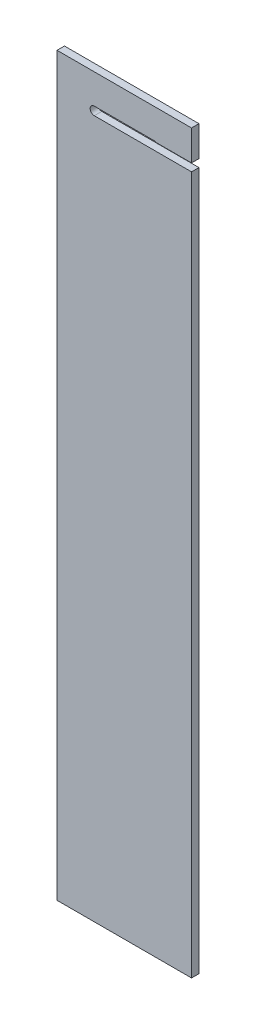
ISO-10303-21;
HEADER;
FILE_DESCRIPTION(('STEP AP214'),'2;1');
FILE_NAME('part.step','',(''),(''),'','','');
FILE_SCHEMA(('AUTOMOTIVE_DESIGN { 1 0 10303 214 1 1 1 1 }'));
ENDSEC;
DATA;
#1=APPLICATION_CONTEXT('core data for automotive mechanical design processes');
#2=APPLICATION_PROTOCOL_DEFINITION('international standard','automotive_design',2000,#1);
#3=PRODUCT_CONTEXT('',#1,'mechanical');
#4=PRODUCT('Part','Part','',(#3));
#5=PRODUCT_RELATED_PRODUCT_CATEGORY('part','',(#4));
#6=PRODUCT_DEFINITION_FORMATION('','',#4);
#7=PRODUCT_DEFINITION_CONTEXT('part definition',#1,'design');
#8=PRODUCT_DEFINITION('design','',#6,#7);
#9=PRODUCT_DEFINITION_SHAPE('','',#8);
#10=(LENGTH_UNIT() NAMED_UNIT(*) SI_UNIT(.MILLI.,.METRE.));
#11=(NAMED_UNIT(*) PLANE_ANGLE_UNIT() SI_UNIT($,.RADIAN.));
#12=(NAMED_UNIT(*) SI_UNIT($,.STERADIAN.) SOLID_ANGLE_UNIT());
#13=UNCERTAINTY_MEASURE_WITH_UNIT(LENGTH_MEASURE(1.E-05),#10,'distance_accuracy_value','');
#14=(GEOMETRIC_REPRESENTATION_CONTEXT(3) GLOBAL_UNCERTAINTY_ASSIGNED_CONTEXT((#13)) GLOBAL_UNIT_ASSIGNED_CONTEXT((#10,
#11,#12)) REPRESENTATION_CONTEXT('',''));
#15=CARTESIAN_POINT('',(0.,0.,0.));
#16=DIRECTION('',(0.,0.,1.));
#17=DIRECTION('',(1.,0.,0.));
#18=AXIS2_PLACEMENT_3D('',#15,#16,#17);
#19=CARTESIAN_POINT('',(28.75,0.,3.175));
#20=DIRECTION('',(1.,0.,0.));
#21=DIRECTION('',(0.,0.,-1.));
#22=AXIS2_PLACEMENT_3D('',#19,#20,#21);
#23=PLANE('',#22);
#24=DIRECTION('',(0.,-1.,0.));
#25=VECTOR('',#24,1.);
#26=CARTESIAN_POINT('',(28.75,0.,0.));
#27=LINE('',#26,#25);
#28=CARTESIAN_POINT('',(28.75,149.225,0.));
#29=VERTEX_POINT('',#28);
#30=CARTESIAN_POINT('',(28.75,-149.225,0.));
#31=VERTEX_POINT('',#30);
#32=EDGE_CURVE('E116',#29,#31,#27,.T.);
#33=ORIENTED_EDGE('',*,*,#32,.F.);
#34=DIRECTION('',(0.,0.,-1.));
#35=VECTOR('',#34,1.);
#36=CARTESIAN_POINT('',(28.75,149.225,3.175));
#37=LINE('',#36,#35);
#38=CARTESIAN_POINT('',(28.75,149.225,3.175));
#39=VERTEX_POINT('',#38);
#40=EDGE_CURVE('E112',#39,#29,#37,.T.);
#41=ORIENTED_EDGE('',*,*,#40,.F.);
#42=DIRECTION('',(0.,-1.,0.));
#43=VECTOR('',#42,1.);
#44=CARTESIAN_POINT('',(28.75,0.,3.175));
#45=LINE('',#44,#43);
#46=CARTESIAN_POINT('',(28.75,-149.225,3.175));
#47=VERTEX_POINT('',#46);
#48=EDGE_CURVE('E114',#39,#47,#45,.T.);
#49=ORIENTED_EDGE('',*,*,#48,.T.);
#50=DIRECTION('',(0.,0.,-1.));
#51=VECTOR('',#50,1.);
#52=CARTESIAN_POINT('',(28.75,-149.225,3.175));
#53=LINE('',#52,#51);
#54=EDGE_CURVE('E152',#47,#31,#53,.T.);
#55=ORIENTED_EDGE('',*,*,#54,.T.);
#56=EDGE_LOOP('',(#33,#41,#49,#55));
#57=FACE_BOUND('',#56,.T.);
#58=ADVANCED_FACE('F35',(#57),#23,.T.);
#59=CARTESIAN_POINT('',(0.,149.225,3.175));
#60=DIRECTION('',(0.,1.,0.));
#61=DIRECTION('',(0.,0.,1.));
#62=AXIS2_PLACEMENT_3D('',#59,#60,#61);
#63=PLANE('',#62);
#64=DIRECTION('',(1.,0.,0.));
#65=VECTOR('',#64,1.);
#66=CARTESIAN_POINT('',(0.,149.225,0.));
#67=LINE('',#66,#65);
#68=CARTESIAN_POINT('',(-12.827,149.225,0.));
#69=VERTEX_POINT('',#68);
#70=EDGE_CURVE('E154',#69,#29,#67,.T.);
#71=ORIENTED_EDGE('',*,*,#70,.F.);
#72=DIRECTION('',(0.,0.,-1.));
#73=VECTOR('',#72,1.);
#74=CARTESIAN_POINT('',(-12.827,149.225,3.175));
#75=LINE('',#74,#73);
#76=CARTESIAN_POINT('',(-12.827,149.225,3.175));
#77=VERTEX_POINT('',#76);
#78=EDGE_CURVE('E122',#77,#69,#75,.T.);
#79=ORIENTED_EDGE('',*,*,#78,.F.);
#80=DIRECTION('',(1.,0.,0.));
#81=VECTOR('',#80,1.);
#82=CARTESIAN_POINT('',(0.,149.225,3.175));
#83=LINE('',#82,#81);
#84=EDGE_CURVE('E127',#77,#39,#83,.T.);
#85=ORIENTED_EDGE('',*,*,#84,.T.);
#86=ORIENTED_EDGE('',*,*,#40,.T.);
#87=EDGE_LOOP('',(#71,#79,#85,#86));
#88=FACE_BOUND('',#87,.T.);
#89=ADVANCED_FACE('F134',(#88),#63,.T.);
#90=CARTESIAN_POINT('',(-12.827,151.003,3.175));
#91=DIRECTION('',(0.,0.,-1.));
#92=DIRECTION('',(-1.,0.,0.));
#93=AXIS2_PLACEMENT_3D('',#90,#91,#92);
#94=CYLINDRICAL_SURFACE('',#93,1.778);
#95=CARTESIAN_POINT('',(-12.827,151.003,0.));
#96=DIRECTION('',(0.,0.,1.));
#97=DIRECTION('',(1.,0.,0.));
#98=AXIS2_PLACEMENT_3D('',#95,#96,#97);
#99=CIRCLE('',#98,1.778);
#100=CARTESIAN_POINT('',(-12.827,152.781,0.));
#101=VERTEX_POINT('',#100);
#102=EDGE_CURVE('E156',#101,#69,#99,.T.);
#103=ORIENTED_EDGE('',*,*,#102,.F.);
#104=DIRECTION('',(0.,0.,-1.));
#105=VECTOR('',#104,1.);
#106=CARTESIAN_POINT('',(-12.827,152.781,3.175));
#107=LINE('',#106,#105);
#108=CARTESIAN_POINT('',(-12.827,152.781,3.175));
#109=VERTEX_POINT('',#108);
#110=EDGE_CURVE('E187',#109,#101,#107,.T.);
#111=ORIENTED_EDGE('',*,*,#110,.F.);
#112=CARTESIAN_POINT('',(-12.827,151.003,3.175));
#113=DIRECTION('',(0.,0.,1.));
#114=DIRECTION('',(1.,0.,0.));
#115=AXIS2_PLACEMENT_3D('',#112,#113,#114);
#116=CIRCLE('',#115,1.778);
#117=EDGE_CURVE('E135',#109,#77,#116,.T.);
#118=ORIENTED_EDGE('',*,*,#117,.T.);
#119=ORIENTED_EDGE('',*,*,#78,.T.);
#120=EDGE_LOOP('',(#103,#111,#118,#119));
#121=FACE_BOUND('',#120,.T.);
#122=ADVANCED_FACE('F217',(#121),#94,.F.);
#123=CARTESIAN_POINT('',(0.,152.781,3.175));
#124=DIRECTION('',(0.,-1.,0.));
#125=DIRECTION('',(0.,0.,-1.));
#126=AXIS2_PLACEMENT_3D('',#123,#124,#125);
#127=PLANE('',#126);
#128=DIRECTION('',(-1.,0.,0.));
#129=VECTOR('',#128,1.);
#130=CARTESIAN_POINT('',(0.,152.781,0.));
#131=LINE('',#130,#129);
#132=CARTESIAN_POINT('',(12.827,152.781,0.));
#133=VERTEX_POINT('',#132);
#134=EDGE_CURVE('E159',#133,#101,#131,.T.);
#135=ORIENTED_EDGE('',*,*,#134,.F.);
#136=DIRECTION('',(0.,0.,-1.));
#137=VECTOR('',#136,1.);
#138=CARTESIAN_POINT('',(12.827,152.781,3.175));
#139=LINE('',#138,#137);
#140=CARTESIAN_POINT('',(12.827,152.781,3.175));
#141=VERTEX_POINT('',#140);
#142=EDGE_CURVE('E185',#141,#133,#139,.T.);
#143=ORIENTED_EDGE('',*,*,#142,.F.);
#144=DIRECTION('',(-1.,0.,0.));
#145=VECTOR('',#144,1.);
#146=CARTESIAN_POINT('',(0.,152.781,3.175));
#147=LINE('',#146,#145);
#148=EDGE_CURVE('E137',#141,#109,#147,.T.);
#149=ORIENTED_EDGE('',*,*,#148,.T.);
#150=ORIENTED_EDGE('',*,*,#110,.T.);
#151=EDGE_LOOP('',(#135,#143,#149,#150));
#152=FACE_BOUND('',#151,.T.);
#153=ADVANCED_FACE('F196',(#152),#127,.T.);
#154=CARTESIAN_POINT('',(0.,152.527,3.175));
#155=DIRECTION('',(0.,-1.,0.));
#156=DIRECTION('',(0.,0.,-1.));
#157=AXIS2_PLACEMENT_3D('',#154,#155,#156);
#158=PLANE('',#157);
#159=DIRECTION('',(-1.,0.,0.));
#160=VECTOR('',#159,1.);
#161=CARTESIAN_POINT('',(0.,152.527,3.175));
#162=LINE('',#161,#160);
#163=CARTESIAN_POINT('',(28.75,152.527,3.175));
#164=VERTEX_POINT('',#163);
#165=CARTESIAN_POINT('',(14.0713407893338,152.527,3.175));
#166=VERTEX_POINT('',#165);
#167=EDGE_CURVE('E142',#164,#166,#162,.T.);
#168=ORIENTED_EDGE('',*,*,#167,.T.);
#169=DIRECTION('',(0.,0.,-1.));
#170=VECTOR('',#169,1.);
#171=CARTESIAN_POINT('',(14.0713407893338,152.527,0.));
#172=LINE('',#171,#170);
#173=CARTESIAN_POINT('',(14.0713407893338,152.527,0.));
#174=VERTEX_POINT('',#173);
#175=EDGE_CURVE('E121',#166,#174,#172,.T.);
#176=ORIENTED_EDGE('',*,*,#175,.T.);
#177=DIRECTION('',(-1.,0.,0.));
#178=VECTOR('',#177,1.);
#179=CARTESIAN_POINT('',(0.,152.527,0.));
#180=LINE('',#179,#178);
#181=CARTESIAN_POINT('',(28.75,152.527,0.));
#182=VERTEX_POINT('',#181);
#183=EDGE_CURVE('E162',#182,#174,#180,.T.);
#184=ORIENTED_EDGE('',*,*,#183,.F.);
#185=DIRECTION('',(0.,0.,-1.));
#186=VECTOR('',#185,1.);
#187=CARTESIAN_POINT('',(28.75,152.527,3.175));
#188=LINE('',#187,#186);
#189=EDGE_CURVE('E183',#164,#182,#188,.T.);
#190=ORIENTED_EDGE('',*,*,#189,.F.);
#191=EDGE_LOOP('',(#168,#176,#184,#190));
#192=FACE_BOUND('',#191,.T.);
#193=ADVANCED_FACE('F199',(#192),#158,.T.);
#194=CARTESIAN_POINT('',(28.75,0.,3.175));
#195=DIRECTION('',(-1.,0.,0.));
#196=DIRECTION('',(0.,0.,1.));
#197=AXIS2_PLACEMENT_3D('',#194,#195,#196);
#198=PLANE('',#197);
#199=DIRECTION('',(0.,1.,0.));
#200=VECTOR('',#199,1.);
#201=CARTESIAN_POINT('',(28.75,0.,0.));
#202=LINE('',#201,#200);
#203=CARTESIAN_POINT('',(28.75,165.481,0.));
#204=VERTEX_POINT('',#203);
#205=EDGE_CURVE('E165',#182,#204,#202,.T.);
#206=ORIENTED_EDGE('',*,*,#205,.T.);
#207=DIRECTION('',(0.,0.,-1.));
#208=VECTOR('',#207,1.);
#209=CARTESIAN_POINT('',(28.75,165.481,3.175));
#210=LINE('',#209,#208);
#211=CARTESIAN_POINT('',(28.75,165.481,3.175));
#212=VERTEX_POINT('',#211);
#213=EDGE_CURVE('E181',#212,#204,#210,.T.);
#214=ORIENTED_EDGE('',*,*,#213,.F.);
#215=DIRECTION('',(0.,1.,0.));
#216=VECTOR('',#215,1.);
#217=CARTESIAN_POINT('',(28.75,0.,3.175));
#218=LINE('',#217,#216);
#219=EDGE_CURVE('E144',#164,#212,#218,.T.);
#220=ORIENTED_EDGE('',*,*,#219,.F.);
#221=ORIENTED_EDGE('',*,*,#189,.T.);
#222=EDGE_LOOP('',(#206,#214,#220,#221));
#223=FACE_BOUND('',#222,.T.);
#224=ADVANCED_FACE('F204',(#223),#198,.F.);
#225=CARTESIAN_POINT('',(0.,165.481,3.175));
#226=DIRECTION('',(0.,1.,0.));
#227=DIRECTION('',(0.,0.,1.));
#228=AXIS2_PLACEMENT_3D('',#225,#226,#227);
#229=PLANE('',#228);
#230=DIRECTION('',(1.,0.,0.));
#231=VECTOR('',#230,1.);
#232=CARTESIAN_POINT('',(0.,165.481,0.));
#233=LINE('',#232,#231);
#234=CARTESIAN_POINT('',(-28.75,165.481,0.));
#235=VERTEX_POINT('',#234);
#236=EDGE_CURVE('E168',#235,#204,#233,.T.);
#237=ORIENTED_EDGE('',*,*,#236,.F.);
#238=DIRECTION('',(0.,0.,-1.));
#239=VECTOR('',#238,1.);
#240=CARTESIAN_POINT('',(-28.75,165.481,3.175));
#241=LINE('',#240,#239);
#242=CARTESIAN_POINT('',(-28.75,165.481,3.175));
#243=VERTEX_POINT('',#242);
#244=EDGE_CURVE('E179',#243,#235,#241,.T.);
#245=ORIENTED_EDGE('',*,*,#244,.F.);
#246=DIRECTION('',(1.,0.,0.));
#247=VECTOR('',#246,1.);
#248=CARTESIAN_POINT('',(0.,165.481,3.175));
#249=LINE('',#248,#247);
#250=EDGE_CURVE('E146',#243,#212,#249,.T.);
#251=ORIENTED_EDGE('',*,*,#250,.T.);
#252=ORIENTED_EDGE('',*,*,#213,.T.);
#253=EDGE_LOOP('',(#237,#245,#251,#252));
#254=FACE_BOUND('',#253,.T.);
#255=ADVANCED_FACE('F207',(#254),#229,.T.);
#256=CARTESIAN_POINT('',(-28.75,0.,3.175));
#257=DIRECTION('',(1.,0.,0.));
#258=DIRECTION('',(0.,0.,-1.));
#259=AXIS2_PLACEMENT_3D('',#256,#257,#258);
#260=PLANE('',#259);
#261=DIRECTION('',(0.,-1.,0.));
#262=VECTOR('',#261,1.);
#263=CARTESIAN_POINT('',(-28.75,0.,0.));
#264=LINE('',#263,#262);
#265=CARTESIAN_POINT('',(-28.75,-149.225,0.));
#266=VERTEX_POINT('',#265);
#267=EDGE_CURVE('E171',#235,#266,#264,.T.);
#268=ORIENTED_EDGE('',*,*,#267,.T.);
#269=DIRECTION('',(0.,0.,-1.));
#270=VECTOR('',#269,1.);
#271=CARTESIAN_POINT('',(-28.75,-149.225,3.175));
#272=LINE('',#271,#270);
#273=CARTESIAN_POINT('',(-28.75,-149.225,3.175));
#274=VERTEX_POINT('',#273);
#275=EDGE_CURVE('E176',#274,#266,#272,.T.);
#276=ORIENTED_EDGE('',*,*,#275,.F.);
#277=DIRECTION('',(0.,-1.,0.));
#278=VECTOR('',#277,1.);
#279=CARTESIAN_POINT('',(-28.75,0.,3.175));
#280=LINE('',#279,#278);
#281=EDGE_CURVE('E149',#243,#274,#280,.T.);
#282=ORIENTED_EDGE('',*,*,#281,.F.);
#283=ORIENTED_EDGE('',*,*,#244,.T.);
#284=EDGE_LOOP('',(#268,#276,#282,#283));
#285=FACE_BOUND('',#284,.T.);
#286=ADVANCED_FACE('F212',(#285),#260,.F.);
#287=CARTESIAN_POINT('',(0.,-149.225,3.175));
#288=DIRECTION('',(0.,1.,0.));
#289=DIRECTION('',(0.,0.,1.));
#290=AXIS2_PLACEMENT_3D('',#287,#288,#289);
#291=PLANE('',#290);
#292=DIRECTION('',(1.,0.,0.));
#293=VECTOR('',#292,1.);
#294=CARTESIAN_POINT('',(0.,-149.225,0.));
#295=LINE('',#294,#293);
#296=EDGE_CURVE('E132',#266,#31,#295,.T.);
#297=ORIENTED_EDGE('',*,*,#296,.T.);
#298=ORIENTED_EDGE('',*,*,#54,.F.);
#299=DIRECTION('',(1.,0.,0.));
#300=VECTOR('',#299,1.);
#301=CARTESIAN_POINT('',(0.,-149.225,3.175));
#302=LINE('',#301,#300);
#303=EDGE_CURVE('E130',#274,#47,#302,.T.);
#304=ORIENTED_EDGE('',*,*,#303,.F.);
#305=ORIENTED_EDGE('',*,*,#275,.T.);
#306=EDGE_LOOP('',(#297,#298,#304,#305));
#307=FACE_BOUND('',#306,.T.);
#308=ADVANCED_FACE('F215',(#307),#291,.F.);
#309=CARTESIAN_POINT('',(0.,0.,3.175));
#310=DIRECTION('',(0.,0.,1.));
#311=DIRECTION('',(1.,0.,0.));
#312=AXIS2_PLACEMENT_3D('',#309,#310,#311);
#313=PLANE('',#312);
#314=ORIENTED_EDGE('',*,*,#148,.F.);
#315=CARTESIAN_POINT('',(14.0713407893338,155.702,3.175));
#316=DIRECTION('',(0.,0.,1.));
#317=DIRECTION('',(1.,0.,0.));
#318=AXIS2_PLACEMENT_3D('',#315,#316,#317);
#319=CIRCLE('',#318,3.175);
#320=EDGE_CURVE('E11',#141,#166,#319,.T.);
#321=ORIENTED_EDGE('',*,*,#320,.T.);
#322=ORIENTED_EDGE('',*,*,#167,.F.);
#323=ORIENTED_EDGE('',*,*,#219,.T.);
#324=ORIENTED_EDGE('',*,*,#250,.F.);
#325=ORIENTED_EDGE('',*,*,#281,.T.);
#326=ORIENTED_EDGE('',*,*,#303,.T.);
#327=ORIENTED_EDGE('',*,*,#48,.F.);
#328=ORIENTED_EDGE('',*,*,#84,.F.);
#329=ORIENTED_EDGE('',*,*,#117,.F.);
#330=EDGE_LOOP('',(#314,#321,#322,#323,#324,#325,#326,#327,#328,#329));
#331=FACE_BOUND('',#330,.T.);
#332=ADVANCED_FACE('F125',(#331),#313,.T.);
#333=CARTESIAN_POINT('',(0.,0.,0.));
#334=DIRECTION('',(0.,0.,1.));
#335=DIRECTION('',(1.,0.,0.));
#336=AXIS2_PLACEMENT_3D('',#333,#334,#335);
#337=PLANE('',#336);
#338=ORIENTED_EDGE('',*,*,#183,.T.);
#339=CARTESIAN_POINT('',(14.0713407893338,155.702,0.));
#340=DIRECTION('',(0.,0.,1.));
#341=DIRECTION('',(1.,0.,0.));
#342=AXIS2_PLACEMENT_3D('',#339,#340,#341);
#343=CIRCLE('',#342,3.175);
#344=EDGE_CURVE('E43',#174,#133,#343,.F.);
#345=ORIENTED_EDGE('',*,*,#344,.T.);
#346=ORIENTED_EDGE('',*,*,#134,.T.);
#347=ORIENTED_EDGE('',*,*,#102,.T.);
#348=ORIENTED_EDGE('',*,*,#70,.T.);
#349=ORIENTED_EDGE('',*,*,#32,.T.);
#350=ORIENTED_EDGE('',*,*,#296,.F.);
#351=ORIENTED_EDGE('',*,*,#267,.F.);
#352=ORIENTED_EDGE('',*,*,#236,.T.);
#353=ORIENTED_EDGE('',*,*,#205,.F.);
#354=EDGE_LOOP('',(#338,#345,#346,#347,#348,#349,#350,#351,#352,#353));
#355=FACE_BOUND('',#354,.T.);
#356=ADVANCED_FACE('F192',(#355),#337,.F.);
#357=CARTESIAN_POINT('',(14.0713407893338,155.702,3.175));
#358=DIRECTION('',(0.,0.,1.));
#359=DIRECTION('',(1.,0.,0.));
#360=AXIS2_PLACEMENT_3D('',#357,#358,#359);
#361=CYLINDRICAL_SURFACE('',#360,3.175);
#362=ORIENTED_EDGE('',*,*,#320,.F.);
#363=ORIENTED_EDGE('',*,*,#142,.T.);
#364=ORIENTED_EDGE('',*,*,#344,.F.);
#365=ORIENTED_EDGE('',*,*,#175,.F.);
#366=EDGE_LOOP('',(#362,#363,#364,#365));
#367=FACE_BOUND('',#366,.T.);
#368=ADVANCED_FACE('F37',(#367),#361,.T.);
#369=CLOSED_SHELL('',(#58,#89,#122,#153,#193,#224,#255,#286,#308,#332,#356,#368));
#370=MANIFOLD_SOLID_BREP('B2',#369);
#371=ADVANCED_BREP_SHAPE_REPRESENTATION('',(#18,#370),#14);
#372=SHAPE_DEFINITION_REPRESENTATION(#9,#371);
ENDSEC;
END-ISO-10303-21;
